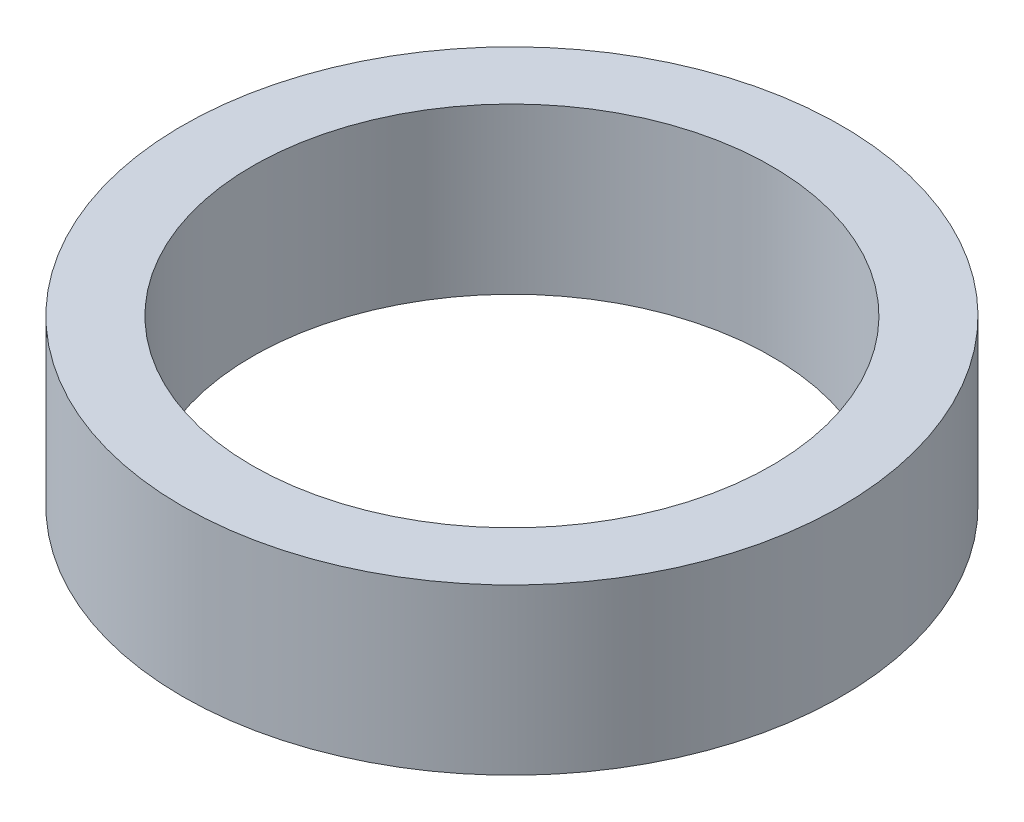
ISO-10303-21;
HEADER;
FILE_DESCRIPTION(('STEP AP214'),'2;1');
FILE_NAME('part.step','',(''),(''),'','','');
FILE_SCHEMA(('AUTOMOTIVE_DESIGN { 1 0 10303 214 1 1 1 1 }'));
ENDSEC;
DATA;
#1=APPLICATION_CONTEXT('core data for automotive mechanical design processes');
#2=APPLICATION_PROTOCOL_DEFINITION('international standard','automotive_design',2000,#1);
#3=PRODUCT_CONTEXT('',#1,'mechanical');
#4=PRODUCT('Part','Part','',(#3));
#5=PRODUCT_RELATED_PRODUCT_CATEGORY('part','',(#4));
#6=PRODUCT_DEFINITION_FORMATION('','',#4);
#7=PRODUCT_DEFINITION_CONTEXT('part definition',#1,'design');
#8=PRODUCT_DEFINITION('design','',#6,#7);
#9=PRODUCT_DEFINITION_SHAPE('','',#8);
#10=(LENGTH_UNIT() NAMED_UNIT(*) SI_UNIT(.MILLI.,.METRE.));
#11=(NAMED_UNIT(*) PLANE_ANGLE_UNIT() SI_UNIT($,.RADIAN.));
#12=(NAMED_UNIT(*) SI_UNIT($,.STERADIAN.) SOLID_ANGLE_UNIT());
#13=UNCERTAINTY_MEASURE_WITH_UNIT(LENGTH_MEASURE(1.E-05),#10,'distance_accuracy_value','');
#14=(GEOMETRIC_REPRESENTATION_CONTEXT(3) GLOBAL_UNCERTAINTY_ASSIGNED_CONTEXT((#13)) GLOBAL_UNIT_ASSIGNED_CONTEXT((#10,
#11,#12)) REPRESENTATION_CONTEXT('',''));
#15=CARTESIAN_POINT('',(0.,0.,0.));
#16=DIRECTION('',(0.,0.,1.));
#17=DIRECTION('',(1.,0.,0.));
#18=AXIS2_PLACEMENT_3D('',#15,#16,#17);
#19=CARTESIAN_POINT('',(0.,2.,0.));
#20=DIRECTION('',(0.,1.,0.));
#21=DIRECTION('',(0.,0.,1.));
#22=AXIS2_PLACEMENT_3D('',#19,#20,#21);
#23=PLANE('',#22);
#24=CARTESIAN_POINT('',(0.,2.,0.));
#25=DIRECTION('',(0.,1.,0.));
#26=DIRECTION('',(0.,0.,1.));
#27=AXIS2_PLACEMENT_3D('',#24,#25,#26);
#28=CIRCLE('',#27,4.);
#29=CARTESIAN_POINT('',(0.,2.,4.));
#30=VERTEX_POINT('',#29);
#31=EDGE_CURVE('E10',#30,#30,#28,.T.);
#32=ORIENTED_EDGE('',*,*,#31,.T.);
#33=EDGE_LOOP('',(#32));
#34=FACE_BOUND('',#33,.T.);
#35=CARTESIAN_POINT('',(0.,2.,0.));
#36=DIRECTION('',(0.,1.,0.));
#37=DIRECTION('',(0.,0.,1.));
#38=AXIS2_PLACEMENT_3D('',#35,#36,#37);
#39=CIRCLE('',#38,3.15);
#40=CARTESIAN_POINT('',(0.,2.,3.15));
#41=VERTEX_POINT('',#40);
#42=EDGE_CURVE('E57',#41,#41,#39,.T.);
#43=ORIENTED_EDGE('',*,*,#42,.F.);
#44=EDGE_LOOP('',(#43));
#45=FACE_BOUND('',#44,.T.);
#46=ADVANCED_FACE('F43',(#34,#45),#23,.T.);
#47=CARTESIAN_POINT('',(0.,0.,0.));
#48=DIRECTION('',(0.,1.,0.));
#49=DIRECTION('',(0.,0.,1.));
#50=AXIS2_PLACEMENT_3D('',#47,#48,#49);
#51=PLANE('',#50);
#52=CARTESIAN_POINT('',(0.,0.,0.));
#53=DIRECTION('',(0.,1.,0.));
#54=DIRECTION('',(0.,0.,1.));
#55=AXIS2_PLACEMENT_3D('',#52,#53,#54);
#56=CIRCLE('',#55,4.);
#57=CARTESIAN_POINT('',(0.,0.,4.));
#58=VERTEX_POINT('',#57);
#59=EDGE_CURVE('E47',#58,#58,#56,.T.);
#60=ORIENTED_EDGE('',*,*,#59,.F.);
#61=EDGE_LOOP('',(#60));
#62=FACE_BOUND('',#61,.T.);
#63=CARTESIAN_POINT('',(0.,0.,0.));
#64=DIRECTION('',(0.,1.,0.));
#65=DIRECTION('',(0.,0.,1.));
#66=AXIS2_PLACEMENT_3D('',#63,#64,#65);
#67=CIRCLE('',#66,3.15);
#68=CARTESIAN_POINT('',(0.,0.,3.15));
#69=VERTEX_POINT('',#68);
#70=EDGE_CURVE('E59',#69,#69,#67,.T.);
#71=ORIENTED_EDGE('',*,*,#70,.T.);
#72=EDGE_LOOP('',(#71));
#73=FACE_BOUND('',#72,.T.);
#74=ADVANCED_FACE('F70',(#62,#73),#51,.F.);
#75=CARTESIAN_POINT('',(0.,2.,0.));
#76=DIRECTION('',(0.,-1.,0.));
#77=DIRECTION('',(0.,0.,-1.));
#78=AXIS2_PLACEMENT_3D('',#75,#76,#77);
#79=CYLINDRICAL_SURFACE('',#78,4.);
#80=ORIENTED_EDGE('',*,*,#31,.F.);
#81=EDGE_LOOP('',(#80));
#82=FACE_BOUND('',#81,.T.);
#83=ORIENTED_EDGE('',*,*,#59,.T.);
#84=EDGE_LOOP('',(#83));
#85=FACE_BOUND('',#84,.T.);
#86=ADVANCED_FACE('F45',(#82,#85),#79,.T.);
#87=CARTESIAN_POINT('',(0.,2.,0.));
#88=DIRECTION('',(0.,-1.,0.));
#89=DIRECTION('',(0.,0.,-1.));
#90=AXIS2_PLACEMENT_3D('',#87,#88,#89);
#91=CYLINDRICAL_SURFACE('',#90,3.15);
#92=ORIENTED_EDGE('',*,*,#42,.T.);
#93=EDGE_LOOP('',(#92));
#94=FACE_BOUND('',#93,.T.);
#95=ORIENTED_EDGE('',*,*,#70,.F.);
#96=EDGE_LOOP('',(#95));
#97=FACE_BOUND('',#96,.T.);
#98=ADVANCED_FACE('F66',(#94,#97),#91,.F.);
#99=CLOSED_SHELL('',(#46,#74,#86,#98));
#100=MANIFOLD_SOLID_BREP('B2',#99);
#101=ADVANCED_BREP_SHAPE_REPRESENTATION('',(#18,#100),#14);
#102=SHAPE_DEFINITION_REPRESENTATION(#9,#101);
ENDSEC;
END-ISO-10303-21;
